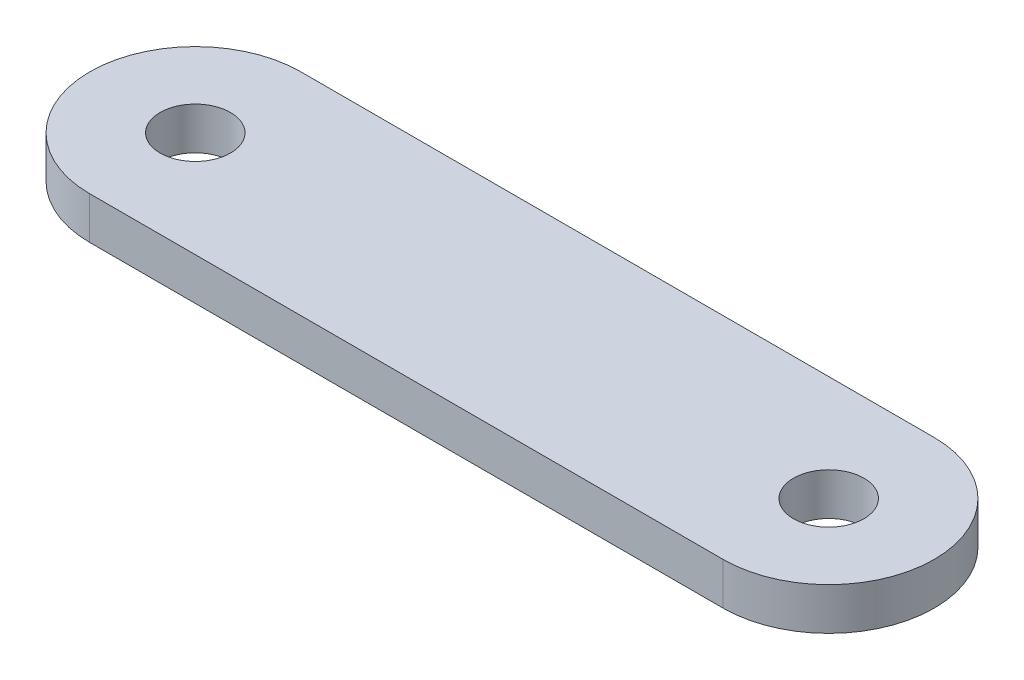
ISO-10303-21;
HEADER;
FILE_DESCRIPTION(('STEP AP214'),'2;1');
FILE_NAME('part.step','',(''),(''),'','','');
FILE_SCHEMA(('AUTOMOTIVE_DESIGN { 1 0 10303 214 1 1 1 1 }'));
ENDSEC;
DATA;
#1=APPLICATION_CONTEXT('core data for automotive mechanical design processes');
#2=APPLICATION_PROTOCOL_DEFINITION('international standard','automotive_design',2000,#1);
#3=PRODUCT_CONTEXT('',#1,'mechanical');
#4=PRODUCT('Part','Part','',(#3));
#5=PRODUCT_RELATED_PRODUCT_CATEGORY('part','',(#4));
#6=PRODUCT_DEFINITION_FORMATION('','',#4);
#7=PRODUCT_DEFINITION_CONTEXT('part definition',#1,'design');
#8=PRODUCT_DEFINITION('design','',#6,#7);
#9=PRODUCT_DEFINITION_SHAPE('','',#8);
#10=(LENGTH_UNIT() NAMED_UNIT(*) SI_UNIT(.MILLI.,.METRE.));
#11=(NAMED_UNIT(*) PLANE_ANGLE_UNIT() SI_UNIT($,.RADIAN.));
#12=(NAMED_UNIT(*) SI_UNIT($,.STERADIAN.) SOLID_ANGLE_UNIT());
#13=UNCERTAINTY_MEASURE_WITH_UNIT(LENGTH_MEASURE(1.E-05),#10,'distance_accuracy_value','');
#14=(GEOMETRIC_REPRESENTATION_CONTEXT(3) GLOBAL_UNCERTAINTY_ASSIGNED_CONTEXT((#13)) GLOBAL_UNIT_ASSIGNED_CONTEXT((#10,
#11,#12)) REPRESENTATION_CONTEXT('',''));
#15=CARTESIAN_POINT('',(0.,0.,0.));
#16=DIRECTION('',(0.,0.,1.));
#17=DIRECTION('',(1.,0.,0.));
#18=AXIS2_PLACEMENT_3D('',#15,#16,#17);
#19=CARTESIAN_POINT('',(45.,6.,0.));
#20=DIRECTION('',(0.,1.,0.));
#21=DIRECTION('',(0.,0.,1.));
#22=AXIS2_PLACEMENT_3D('',#19,#20,#21);
#23=PLANE('',#22);
#24=CARTESIAN_POINT('',(-45.,6.,0.));
#25=DIRECTION('',(0.,1.,0.));
#26=DIRECTION('',(0.,0.,1.));
#27=AXIS2_PLACEMENT_3D('',#24,#25,#26);
#28=CIRCLE('',#27,5.);
#29=CARTESIAN_POINT('',(-45.,6.,5.));
#30=VERTEX_POINT('',#29);
#31=EDGE_CURVE('E112',#30,#30,#28,.T.);
#32=ORIENTED_EDGE('',*,*,#31,.F.);
#33=EDGE_LOOP('',(#32));
#34=FACE_BOUND('',#33,.T.);
#35=CARTESIAN_POINT('',(45.,6.,0.));
#36=DIRECTION('',(0.,1.,0.));
#37=DIRECTION('',(0.,0.,1.));
#38=AXIS2_PLACEMENT_3D('',#35,#36,#37);
#39=CIRCLE('',#38,15.);
#40=CARTESIAN_POINT('',(45.,6.,15.));
#41=VERTEX_POINT('',#40);
#42=CARTESIAN_POINT('',(45.,6.,-15.));
#43=VERTEX_POINT('',#42);
#44=EDGE_CURVE('E92',#41,#43,#39,.T.);
#45=ORIENTED_EDGE('',*,*,#44,.T.);
#46=DIRECTION('',(-1.,0.,0.));
#47=VECTOR('',#46,1.);
#48=CARTESIAN_POINT('',(-45.,6.,-15.));
#49=LINE('',#48,#47);
#50=CARTESIAN_POINT('',(-45.,6.,-15.));
#51=VERTEX_POINT('',#50);
#52=EDGE_CURVE('E87',#43,#51,#49,.T.);
#53=ORIENTED_EDGE('',*,*,#52,.T.);
#54=CARTESIAN_POINT('',(-45.,6.,0.));
#55=DIRECTION('',(0.,1.,0.));
#56=DIRECTION('',(0.,0.,1.));
#57=AXIS2_PLACEMENT_3D('',#54,#55,#56);
#58=CIRCLE('',#57,15.);
#59=CARTESIAN_POINT('',(-45.,6.,15.));
#60=VERTEX_POINT('',#59);
#61=EDGE_CURVE('E90',#51,#60,#58,.T.);
#62=ORIENTED_EDGE('',*,*,#61,.T.);
#63=DIRECTION('',(1.,0.,0.));
#64=VECTOR('',#63,1.);
#65=CARTESIAN_POINT('',(-45.,6.,15.));
#66=LINE('',#65,#64);
#67=EDGE_CURVE('E57',#60,#41,#66,.T.);
#68=ORIENTED_EDGE('',*,*,#67,.T.);
#69=EDGE_LOOP('',(#45,#53,#62,#68));
#70=FACE_BOUND('',#69,.T.);
#71=CARTESIAN_POINT('',(45.,6.,0.));
#72=DIRECTION('',(0.,1.,0.));
#73=DIRECTION('',(0.,0.,1.));
#74=AXIS2_PLACEMENT_3D('',#71,#72,#73);
#75=CIRCLE('',#74,5.);
#76=CARTESIAN_POINT('',(45.,6.,5.));
#77=VERTEX_POINT('',#76);
#78=EDGE_CURVE('E134',#77,#77,#75,.T.);
#79=ORIENTED_EDGE('',*,*,#78,.F.);
#80=EDGE_LOOP('',(#79));
#81=FACE_BOUND('',#80,.T.);
#82=ADVANCED_FACE('F39',(#34,#70,#81),#23,.T.);
#83=CARTESIAN_POINT('',(45.,0.,0.));
#84=DIRECTION('',(0.,1.,0.));
#85=DIRECTION('',(0.,0.,1.));
#86=AXIS2_PLACEMENT_3D('',#83,#84,#85);
#87=PLANE('',#86);
#88=CARTESIAN_POINT('',(45.,0.,0.));
#89=DIRECTION('',(0.,1.,0.));
#90=DIRECTION('',(0.,0.,1.));
#91=AXIS2_PLACEMENT_3D('',#88,#89,#90);
#92=CIRCLE('',#91,15.);
#93=CARTESIAN_POINT('',(45.,0.,15.));
#94=VERTEX_POINT('',#93);
#95=CARTESIAN_POINT('',(45.,0.,-15.));
#96=VERTEX_POINT('',#95);
#97=EDGE_CURVE('E108',#94,#96,#92,.T.);
#98=ORIENTED_EDGE('',*,*,#97,.F.);
#99=DIRECTION('',(1.,0.,0.));
#100=VECTOR('',#99,1.);
#101=CARTESIAN_POINT('',(-45.,0.,15.));
#102=LINE('',#101,#100);
#103=CARTESIAN_POINT('',(-45.,0.,15.));
#104=VERTEX_POINT('',#103);
#105=EDGE_CURVE('E80',#104,#94,#102,.T.);
#106=ORIENTED_EDGE('',*,*,#105,.F.);
#107=CARTESIAN_POINT('',(-45.,0.,0.));
#108=DIRECTION('',(0.,1.,0.));
#109=DIRECTION('',(0.,0.,1.));
#110=AXIS2_PLACEMENT_3D('',#107,#108,#109);
#111=CIRCLE('',#110,15.);
#112=CARTESIAN_POINT('',(-45.,0.,-15.));
#113=VERTEX_POINT('',#112);
#114=EDGE_CURVE('E74',#113,#104,#111,.T.);
#115=ORIENTED_EDGE('',*,*,#114,.F.);
#116=DIRECTION('',(-1.,0.,0.));
#117=VECTOR('',#116,1.);
#118=CARTESIAN_POINT('',(-45.,0.,-15.));
#119=LINE('',#118,#117);
#120=EDGE_CURVE('E97',#96,#113,#119,.T.);
#121=ORIENTED_EDGE('',*,*,#120,.F.);
#122=EDGE_LOOP('',(#98,#106,#115,#121));
#123=FACE_BOUND('',#122,.T.);
#124=CARTESIAN_POINT('',(-45.,0.,0.));
#125=DIRECTION('',(0.,1.,0.));
#126=DIRECTION('',(0.,0.,1.));
#127=AXIS2_PLACEMENT_3D('',#124,#125,#126);
#128=CIRCLE('',#127,5.);
#129=CARTESIAN_POINT('',(-45.,0.,5.));
#130=VERTEX_POINT('',#129);
#131=EDGE_CURVE('E130',#130,#130,#128,.T.);
#132=ORIENTED_EDGE('',*,*,#131,.T.);
#133=EDGE_LOOP('',(#132));
#134=FACE_BOUND('',#133,.T.);
#135=CARTESIAN_POINT('',(45.,0.,0.));
#136=DIRECTION('',(0.,1.,0.));
#137=DIRECTION('',(0.,0.,1.));
#138=AXIS2_PLACEMENT_3D('',#135,#136,#137);
#139=CIRCLE('',#138,5.);
#140=CARTESIAN_POINT('',(45.,0.,5.));
#141=VERTEX_POINT('',#140);
#142=EDGE_CURVE('E138',#141,#141,#139,.T.);
#143=ORIENTED_EDGE('',*,*,#142,.T.);
#144=EDGE_LOOP('',(#143));
#145=FACE_BOUND('',#144,.T.);
#146=ADVANCED_FACE('F125',(#123,#134,#145),#87,.F.);
#147=CARTESIAN_POINT('',(45.,6.,0.));
#148=DIRECTION('',(0.,-1.,0.));
#149=DIRECTION('',(0.,0.,-1.));
#150=AXIS2_PLACEMENT_3D('',#147,#148,#149);
#151=CYLINDRICAL_SURFACE('',#150,15.);
#152=ORIENTED_EDGE('',*,*,#97,.T.);
#153=DIRECTION('',(0.,-1.,0.));
#154=VECTOR('',#153,1.);
#155=CARTESIAN_POINT('',(45.,6.,-15.));
#156=LINE('',#155,#154);
#157=EDGE_CURVE('E11',#43,#96,#156,.T.);
#158=ORIENTED_EDGE('',*,*,#157,.F.);
#159=ORIENTED_EDGE('',*,*,#44,.F.);
#160=DIRECTION('',(0.,-1.,0.));
#161=VECTOR('',#160,1.);
#162=CARTESIAN_POINT('',(45.,6.,15.));
#163=LINE('',#162,#161);
#164=EDGE_CURVE('E104',#41,#94,#163,.T.);
#165=ORIENTED_EDGE('',*,*,#164,.T.);
#166=EDGE_LOOP('',(#152,#158,#159,#165));
#167=FACE_BOUND('',#166,.T.);
#168=ADVANCED_FACE('F41',(#167),#151,.T.);
#169=CARTESIAN_POINT('',(-45.,6.,-15.));
#170=DIRECTION('',(0.,0.,1.));
#171=DIRECTION('',(1.,0.,0.));
#172=AXIS2_PLACEMENT_3D('',#169,#170,#171);
#173=PLANE('',#172);
#174=ORIENTED_EDGE('',*,*,#120,.T.);
#175=DIRECTION('',(0.,-1.,0.));
#176=VECTOR('',#175,1.);
#177=CARTESIAN_POINT('',(-45.,6.,-15.));
#178=LINE('',#177,#176);
#179=EDGE_CURVE('E49',#51,#113,#178,.T.);
#180=ORIENTED_EDGE('',*,*,#179,.F.);
#181=ORIENTED_EDGE('',*,*,#52,.F.);
#182=ORIENTED_EDGE('',*,*,#157,.T.);
#183=EDGE_LOOP('',(#174,#180,#181,#182));
#184=FACE_BOUND('',#183,.T.);
#185=ADVANCED_FACE('F96',(#184),#173,.F.);
#186=CARTESIAN_POINT('',(-45.,6.,0.));
#187=DIRECTION('',(0.,-1.,0.));
#188=DIRECTION('',(0.,0.,-1.));
#189=AXIS2_PLACEMENT_3D('',#186,#187,#188);
#190=CYLINDRICAL_SURFACE('',#189,15.);
#191=ORIENTED_EDGE('',*,*,#114,.T.);
#192=DIRECTION('',(0.,-1.,0.));
#193=VECTOR('',#192,1.);
#194=CARTESIAN_POINT('',(-45.,6.,15.));
#195=LINE('',#194,#193);
#196=EDGE_CURVE('E99',#60,#104,#195,.T.);
#197=ORIENTED_EDGE('',*,*,#196,.F.);
#198=ORIENTED_EDGE('',*,*,#61,.F.);
#199=ORIENTED_EDGE('',*,*,#179,.T.);
#200=EDGE_LOOP('',(#191,#197,#198,#199));
#201=FACE_BOUND('',#200,.T.);
#202=ADVANCED_FACE('F100',(#201),#190,.T.);
#203=CARTESIAN_POINT('',(-45.,6.,15.));
#204=DIRECTION('',(0.,0.,-1.));
#205=DIRECTION('',(-1.,0.,0.));
#206=AXIS2_PLACEMENT_3D('',#203,#204,#205);
#207=PLANE('',#206);
#208=ORIENTED_EDGE('',*,*,#105,.T.);
#209=ORIENTED_EDGE('',*,*,#164,.F.);
#210=ORIENTED_EDGE('',*,*,#67,.F.);
#211=ORIENTED_EDGE('',*,*,#196,.T.);
#212=EDGE_LOOP('',(#208,#209,#210,#211));
#213=FACE_BOUND('',#212,.T.);
#214=ADVANCED_FACE('F122',(#213),#207,.F.);
#215=CARTESIAN_POINT('',(-45.,6.,0.));
#216=DIRECTION('',(0.,-1.,0.));
#217=DIRECTION('',(0.,0.,-1.));
#218=AXIS2_PLACEMENT_3D('',#215,#216,#217);
#219=CYLINDRICAL_SURFACE('',#218,5.);
#220=ORIENTED_EDGE('',*,*,#31,.T.);
#221=EDGE_LOOP('',(#220));
#222=FACE_BOUND('',#221,.T.);
#223=ORIENTED_EDGE('',*,*,#131,.F.);
#224=EDGE_LOOP('',(#223));
#225=FACE_BOUND('',#224,.T.);
#226=ADVANCED_FACE('F157',(#222,#225),#219,.F.);
#227=CARTESIAN_POINT('',(45.,6.,0.));
#228=DIRECTION('',(0.,-1.,0.));
#229=DIRECTION('',(0.,0.,-1.));
#230=AXIS2_PLACEMENT_3D('',#227,#228,#229);
#231=CYLINDRICAL_SURFACE('',#230,5.);
#232=ORIENTED_EDGE('',*,*,#78,.T.);
#233=EDGE_LOOP('',(#232));
#234=FACE_BOUND('',#233,.T.);
#235=ORIENTED_EDGE('',*,*,#142,.F.);
#236=EDGE_LOOP('',(#235));
#237=FACE_BOUND('',#236,.T.);
#238=ADVANCED_FACE('F146',(#234,#237),#231,.F.);
#239=CLOSED_SHELL('',(#82,#146,#168,#185,#202,#214,#226,#238));
#240=MANIFOLD_SOLID_BREP('B2',#239);
#241=ADVANCED_BREP_SHAPE_REPRESENTATION('',(#18,#240),#14);
#242=SHAPE_DEFINITION_REPRESENTATION(#9,#241);
ENDSEC;
END-ISO-10303-21;
